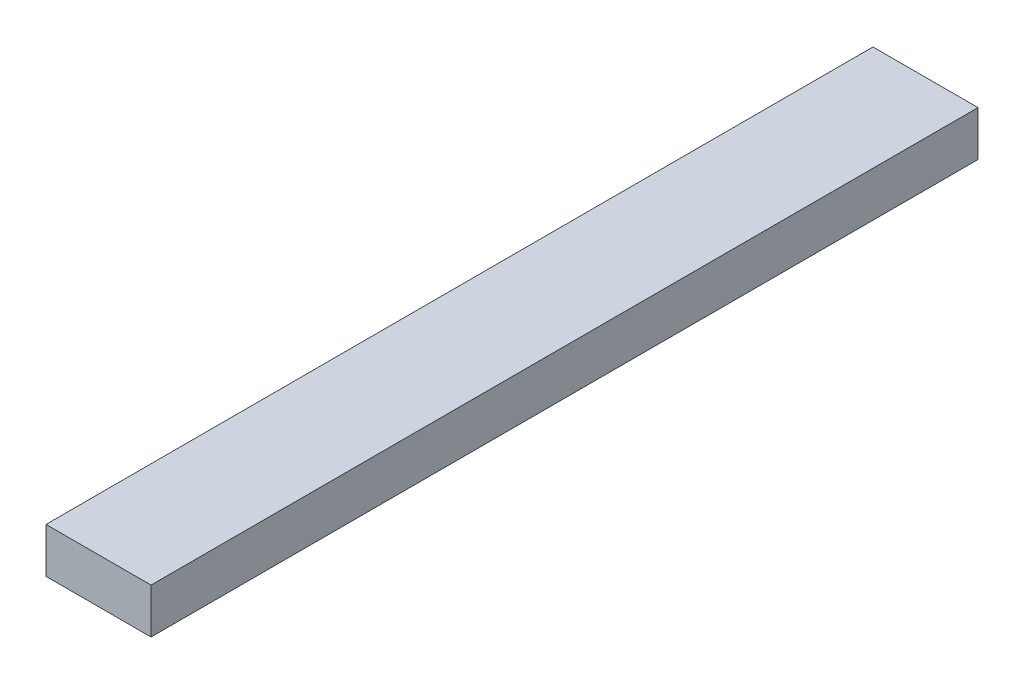
ISO-10303-21;
HEADER;
FILE_DESCRIPTION(('STEP AP214'),'2;1');
FILE_NAME('part.step','',(''),(''),'','','');
FILE_SCHEMA(('AUTOMOTIVE_DESIGN { 1 0 10303 214 1 1 1 1 }'));
ENDSEC;
DATA;
#1=APPLICATION_CONTEXT('core data for automotive mechanical design processes');
#2=APPLICATION_PROTOCOL_DEFINITION('international standard','automotive_design',2000,#1);
#3=PRODUCT_CONTEXT('',#1,'mechanical');
#4=PRODUCT('Part','Part','',(#3));
#5=PRODUCT_RELATED_PRODUCT_CATEGORY('part','',(#4));
#6=PRODUCT_DEFINITION_FORMATION('','',#4);
#7=PRODUCT_DEFINITION_CONTEXT('part definition',#1,'design');
#8=PRODUCT_DEFINITION('design','',#6,#7);
#9=PRODUCT_DEFINITION_SHAPE('','',#8);
#10=(LENGTH_UNIT() NAMED_UNIT(*) SI_UNIT(.MILLI.,.METRE.));
#11=(NAMED_UNIT(*) PLANE_ANGLE_UNIT() SI_UNIT($,.RADIAN.));
#12=(NAMED_UNIT(*) SI_UNIT($,.STERADIAN.) SOLID_ANGLE_UNIT());
#13=UNCERTAINTY_MEASURE_WITH_UNIT(LENGTH_MEASURE(1.E-05),#10,'distance_accuracy_value','');
#14=(GEOMETRIC_REPRESENTATION_CONTEXT(3) GLOBAL_UNCERTAINTY_ASSIGNED_CONTEXT((#13)) GLOBAL_UNIT_ASSIGNED_CONTEXT((#10,
#11,#12)) REPRESENTATION_CONTEXT('',''));
#15=CARTESIAN_POINT('',(0.,0.,0.));
#16=DIRECTION('',(0.,0.,1.));
#17=DIRECTION('',(1.,0.,0.));
#18=AXIS2_PLACEMENT_3D('',#15,#16,#17);
#19=CARTESIAN_POINT('',(44.45,-19.05,700.));
#20=DIRECTION('',(-1.,0.,0.));
#21=DIRECTION('',(0.,0.,1.));
#22=AXIS2_PLACEMENT_3D('',#19,#20,#21);
#23=PLANE('',#22);
#24=DIRECTION('',(0.,1.,0.));
#25=VECTOR('',#24,1.);
#26=CARTESIAN_POINT('',(44.45,-19.05,0.));
#27=LINE('',#26,#25);
#28=CARTESIAN_POINT('',(44.45,-19.05,0.));
#29=VERTEX_POINT('',#28);
#30=CARTESIAN_POINT('',(44.45,19.05,0.));
#31=VERTEX_POINT('',#30);
#32=EDGE_CURVE('E96',#29,#31,#27,.T.);
#33=ORIENTED_EDGE('',*,*,#32,.T.);
#34=DIRECTION('',(0.,0.,-1.));
#35=VECTOR('',#34,1.);
#36=CARTESIAN_POINT('',(44.45,19.05,700.));
#37=LINE('',#36,#35);
#38=CARTESIAN_POINT('',(44.45,19.05,700.));
#39=VERTEX_POINT('',#38);
#40=EDGE_CURVE('E11',#39,#31,#37,.T.);
#41=ORIENTED_EDGE('',*,*,#40,.F.);
#42=DIRECTION('',(0.,1.,0.));
#43=VECTOR('',#42,1.);
#44=CARTESIAN_POINT('',(44.45,-19.05,700.));
#45=LINE('',#44,#43);
#46=CARTESIAN_POINT('',(44.45,-19.05,700.));
#47=VERTEX_POINT('',#46);
#48=EDGE_CURVE('E84',#47,#39,#45,.T.);
#49=ORIENTED_EDGE('',*,*,#48,.F.);
#50=DIRECTION('',(0.,0.,-1.));
#51=VECTOR('',#50,1.);
#52=CARTESIAN_POINT('',(44.45,-19.05,700.));
#53=LINE('',#52,#51);
#54=EDGE_CURVE('E92',#47,#29,#53,.T.);
#55=ORIENTED_EDGE('',*,*,#54,.T.);
#56=EDGE_LOOP('',(#33,#41,#49,#55));
#57=FACE_BOUND('',#56,.T.);
#58=ADVANCED_FACE('F33',(#57),#23,.F.);
#59=CARTESIAN_POINT('',(-44.45,19.05,700.));
#60=DIRECTION('',(0.,-1.,0.));
#61=DIRECTION('',(0.,0.,-1.));
#62=AXIS2_PLACEMENT_3D('',#59,#60,#61);
#63=PLANE('',#62);
#64=DIRECTION('',(-1.,0.,0.));
#65=VECTOR('',#64,1.);
#66=CARTESIAN_POINT('',(-44.45,19.05,0.));
#67=LINE('',#66,#65);
#68=CARTESIAN_POINT('',(-44.45,19.05,0.));
#69=VERTEX_POINT('',#68);
#70=EDGE_CURVE('E88',#31,#69,#67,.T.);
#71=ORIENTED_EDGE('',*,*,#70,.T.);
#72=DIRECTION('',(0.,0.,-1.));
#73=VECTOR('',#72,1.);
#74=CARTESIAN_POINT('',(-44.45,19.05,700.));
#75=LINE('',#74,#73);
#76=CARTESIAN_POINT('',(-44.45,19.05,700.));
#77=VERTEX_POINT('',#76);
#78=EDGE_CURVE('E41',#77,#69,#75,.T.);
#79=ORIENTED_EDGE('',*,*,#78,.F.);
#80=DIRECTION('',(-1.,0.,0.));
#81=VECTOR('',#80,1.);
#82=CARTESIAN_POINT('',(-44.45,19.05,700.));
#83=LINE('',#82,#81);
#84=EDGE_CURVE('E79',#39,#77,#83,.T.);
#85=ORIENTED_EDGE('',*,*,#84,.F.);
#86=ORIENTED_EDGE('',*,*,#40,.T.);
#87=EDGE_LOOP('',(#71,#79,#85,#86));
#88=FACE_BOUND('',#87,.T.);
#89=ADVANCED_FACE('F87',(#88),#63,.F.);
#90=CARTESIAN_POINT('',(-44.45,-19.05,700.));
#91=DIRECTION('',(1.,0.,0.));
#92=DIRECTION('',(0.,0.,-1.));
#93=AXIS2_PLACEMENT_3D('',#90,#91,#92);
#94=PLANE('',#93);
#95=DIRECTION('',(0.,-1.,0.));
#96=VECTOR('',#95,1.);
#97=CARTESIAN_POINT('',(-44.45,-19.05,0.));
#98=LINE('',#97,#96);
#99=CARTESIAN_POINT('',(-44.45,-19.05,0.));
#100=VERTEX_POINT('',#99);
#101=EDGE_CURVE('E66',#69,#100,#98,.T.);
#102=ORIENTED_EDGE('',*,*,#101,.T.);
#103=DIRECTION('',(0.,0.,-1.));
#104=VECTOR('',#103,1.);
#105=CARTESIAN_POINT('',(-44.45,-19.05,700.));
#106=LINE('',#105,#104);
#107=CARTESIAN_POINT('',(-44.45,-19.05,700.));
#108=VERTEX_POINT('',#107);
#109=EDGE_CURVE('E89',#108,#100,#106,.T.);
#110=ORIENTED_EDGE('',*,*,#109,.F.);
#111=DIRECTION('',(0.,-1.,0.));
#112=VECTOR('',#111,1.);
#113=CARTESIAN_POINT('',(-44.45,-19.05,700.));
#114=LINE('',#113,#112);
#115=EDGE_CURVE('E82',#77,#108,#114,.T.);
#116=ORIENTED_EDGE('',*,*,#115,.F.);
#117=ORIENTED_EDGE('',*,*,#78,.T.);
#118=EDGE_LOOP('',(#102,#110,#116,#117));
#119=FACE_BOUND('',#118,.T.);
#120=ADVANCED_FACE('F90',(#119),#94,.F.);
#121=CARTESIAN_POINT('',(-44.45,-19.05,700.));
#122=DIRECTION('',(0.,1.,0.));
#123=DIRECTION('',(0.,0.,1.));
#124=AXIS2_PLACEMENT_3D('',#121,#122,#123);
#125=PLANE('',#124);
#126=DIRECTION('',(1.,0.,0.));
#127=VECTOR('',#126,1.);
#128=CARTESIAN_POINT('',(-44.45,-19.05,0.));
#129=LINE('',#128,#127);
#130=EDGE_CURVE('E72',#100,#29,#129,.T.);
#131=ORIENTED_EDGE('',*,*,#130,.T.);
#132=ORIENTED_EDGE('',*,*,#54,.F.);
#133=DIRECTION('',(1.,0.,0.));
#134=VECTOR('',#133,1.);
#135=CARTESIAN_POINT('',(-44.45,-19.05,700.));
#136=LINE('',#135,#134);
#137=EDGE_CURVE('E49',#108,#47,#136,.T.);
#138=ORIENTED_EDGE('',*,*,#137,.F.);
#139=ORIENTED_EDGE('',*,*,#109,.T.);
#140=EDGE_LOOP('',(#131,#132,#138,#139));
#141=FACE_BOUND('',#140,.T.);
#142=ADVANCED_FACE('F103',(#141),#125,.F.);
#143=CARTESIAN_POINT('',(0.,0.,700.));
#144=DIRECTION('',(0.,0.,-1.));
#145=DIRECTION('',(-1.,0.,0.));
#146=AXIS2_PLACEMENT_3D('',#143,#144,#145);
#147=PLANE('',#146);
#148=ORIENTED_EDGE('',*,*,#48,.T.);
#149=ORIENTED_EDGE('',*,*,#84,.T.);
#150=ORIENTED_EDGE('',*,*,#115,.T.);
#151=ORIENTED_EDGE('',*,*,#137,.T.);
#152=EDGE_LOOP('',(#148,#149,#150,#151));
#153=FACE_BOUND('',#152,.T.);
#154=ADVANCED_FACE('F80',(#153),#147,.F.);
#155=CARTESIAN_POINT('',(0.,0.,0.));
#156=DIRECTION('',(0.,0.,-1.));
#157=DIRECTION('',(-1.,0.,0.));
#158=AXIS2_PLACEMENT_3D('',#155,#156,#157);
#159=PLANE('',#158);
#160=ORIENTED_EDGE('',*,*,#32,.F.);
#161=ORIENTED_EDGE('',*,*,#130,.F.);
#162=ORIENTED_EDGE('',*,*,#101,.F.);
#163=ORIENTED_EDGE('',*,*,#70,.F.);
#164=EDGE_LOOP('',(#160,#161,#162,#163));
#165=FACE_BOUND('',#164,.T.);
#166=ADVANCED_FACE('F106',(#165),#159,.T.);
#167=CLOSED_SHELL('',(#58,#89,#120,#142,#154,#166));
#168=MANIFOLD_SOLID_BREP('B2',#167);
#169=ADVANCED_BREP_SHAPE_REPRESENTATION('',(#18,#168),#14);
#170=SHAPE_DEFINITION_REPRESENTATION(#9,#169);
ENDSEC;
END-ISO-10303-21;
